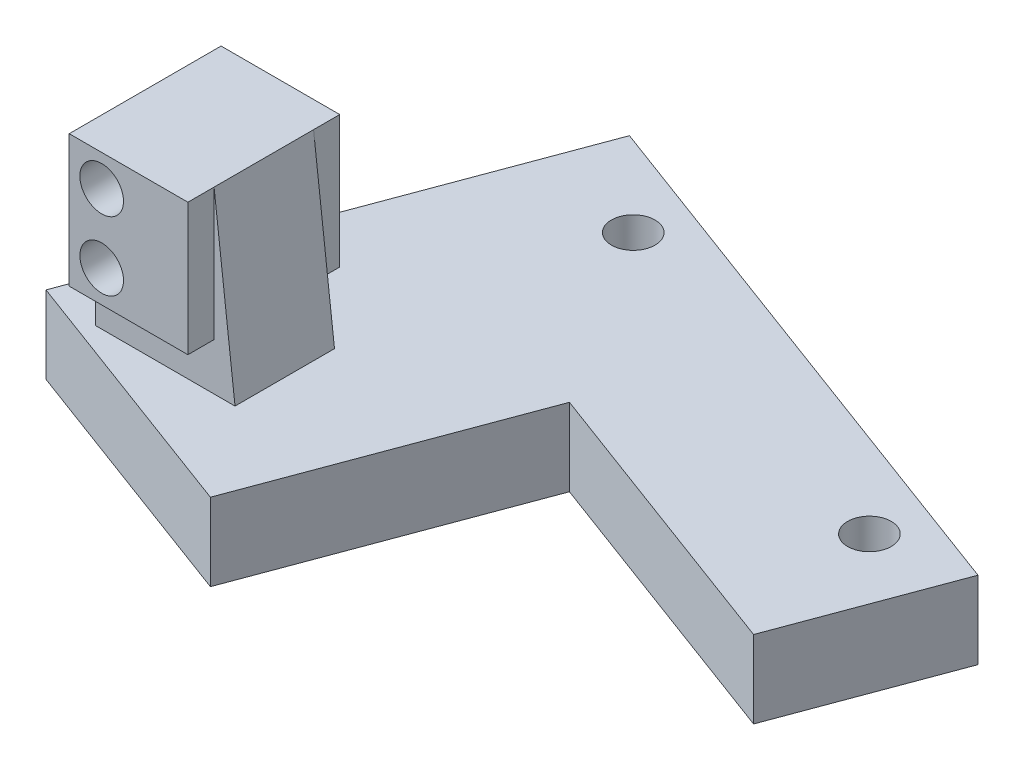
ISO-10303-21;
HEADER;
FILE_DESCRIPTION(('STEP AP214'),'2;1');
FILE_NAME('part.step','',(''),(''),'','','');
FILE_SCHEMA(('AUTOMOTIVE_DESIGN { 1 0 10303 214 1 1 1 1 }'));
ENDSEC;
DATA;
#1=APPLICATION_CONTEXT('core data for automotive mechanical design processes');
#2=APPLICATION_PROTOCOL_DEFINITION('international standard','automotive_design',2000,#1);
#3=PRODUCT_CONTEXT('',#1,'mechanical');
#4=PRODUCT('Part','Part','',(#3));
#5=PRODUCT_RELATED_PRODUCT_CATEGORY('part','',(#4));
#6=PRODUCT_DEFINITION_FORMATION('','',#4);
#7=PRODUCT_DEFINITION_CONTEXT('part definition',#1,'design');
#8=PRODUCT_DEFINITION('design','',#6,#7);
#9=PRODUCT_DEFINITION_SHAPE('','',#8);
#10=(LENGTH_UNIT() NAMED_UNIT(*) SI_UNIT(.MILLI.,.METRE.));
#11=(NAMED_UNIT(*) PLANE_ANGLE_UNIT() SI_UNIT($,.RADIAN.));
#12=(NAMED_UNIT(*) SI_UNIT($,.STERADIAN.) SOLID_ANGLE_UNIT());
#13=UNCERTAINTY_MEASURE_WITH_UNIT(LENGTH_MEASURE(1.E-05),#10,'distance_accuracy_value','');
#14=(GEOMETRIC_REPRESENTATION_CONTEXT(3) GLOBAL_UNCERTAINTY_ASSIGNED_CONTEXT((#13)) GLOBAL_UNIT_ASSIGNED_CONTEXT((#10,
#11,#12)) REPRESENTATION_CONTEXT('',''));
#15=CARTESIAN_POINT('',(0.,0.,0.));
#16=DIRECTION('',(0.,0.,1.));
#17=DIRECTION('',(1.,0.,0.));
#18=AXIS2_PLACEMENT_3D('',#15,#16,#17);
#19=CARTESIAN_POINT('',(-91.4998945327473,128.571708482202,-55.16093843316));
#20=DIRECTION('',(-1.,0.,0.));
#21=DIRECTION('',(0.,0.,-1.));
#22=AXIS2_PLACEMENT_3D('',#19,#20,#21);
#23=PLANE('',#22);
#24=DIRECTION('',(0.,-1.,0.));
#25=VECTOR('',#24,1.);
#26=CARTESIAN_POINT('',(-91.4998945327473,128.571708482202,-3.81));
#27=LINE('',#26,#25);
#28=CARTESIAN_POINT('',(-91.4998945327473,128.571708482202,-3.81));
#29=VERTEX_POINT('',#28);
#30=CARTESIAN_POINT('',(-91.4998945327473,109.348000374125,-3.81));
#31=VERTEX_POINT('',#30);
#32=EDGE_CURVE('E164',#29,#31,#27,.T.);
#33=ORIENTED_EDGE('',*,*,#32,.F.);
#34=DIRECTION('',(0.,0.,1.));
#35=VECTOR('',#34,1.);
#36=CARTESIAN_POINT('',(-91.4998945327473,128.571708482202,-55.16093843316));
#37=LINE('',#36,#35);
#38=CARTESIAN_POINT('',(-91.4998945327473,128.571708482202,0.));
#39=VERTEX_POINT('',#38);
#40=EDGE_CURVE('E260',#29,#39,#37,.T.);
#41=ORIENTED_EDGE('',*,*,#40,.T.);
#42=DIRECTION('',(0.,1.,0.));
#43=VECTOR('',#42,1.);
#44=CARTESIAN_POINT('',(-91.4998945327473,128.571708482202,0.));
#45=LINE('',#44,#43);
#46=CARTESIAN_POINT('',(-91.4998945327473,109.348000374125,0.));
#47=VERTEX_POINT('',#46);
#48=EDGE_CURVE('E249',#47,#39,#45,.T.);
#49=ORIENTED_EDGE('',*,*,#48,.F.);
#50=DIRECTION('',(0.,0.,-1.));
#51=VECTOR('',#50,1.);
#52=CARTESIAN_POINT('',(-91.4998945327473,109.348000374125,0.));
#53=LINE('',#52,#51);
#54=EDGE_CURVE('E175',#47,#31,#53,.T.);
#55=ORIENTED_EDGE('',*,*,#54,.T.);
#56=EDGE_LOOP('',(#33,#41,#49,#55));
#57=FACE_BOUND('',#56,.T.);
#58=ADVANCED_FACE('F41',(#57),#23,.F.);
#59=DIRECTION('',(0.,-1.,0.));
#60=VECTOR('',#59,1.);
#61=CARTESIAN_POINT('',(-91.4998945327473,128.571708482202,-18.288));
#62=LINE('',#61,#60);
#63=CARTESIAN_POINT('',(-91.4998945327473,128.571708482202,-18.288));
#64=VERTEX_POINT('',#63);
#65=CARTESIAN_POINT('',(-91.4998945327473,109.348000374125,-18.288));
#66=VERTEX_POINT('',#65);
#67=EDGE_CURVE('E151',#64,#66,#62,.T.);
#68=ORIENTED_EDGE('',*,*,#67,.T.);
#69=DIRECTION('',(0.,0.,-1.));
#70=VECTOR('',#69,1.);
#71=CARTESIAN_POINT('',(-91.4998945327473,109.348000374125,-22.0979999999999));
#72=LINE('',#71,#70);
#73=CARTESIAN_POINT('',(-91.4998945327473,109.348000374125,-22.0979999999999));
#74=VERTEX_POINT('',#73);
#75=EDGE_CURVE('E170',#66,#74,#72,.T.);
#76=ORIENTED_EDGE('',*,*,#75,.T.);
#77=DIRECTION('',(0.,-1.,0.));
#78=VECTOR('',#77,1.);
#79=CARTESIAN_POINT('',(-91.4998945327473,128.571708482202,-22.0979999999999));
#80=LINE('',#79,#78);
#81=CARTESIAN_POINT('',(-91.4998945327473,128.571708482202,-22.0979999999999));
#82=VERTEX_POINT('',#81);
#83=EDGE_CURVE('E252',#82,#74,#80,.T.);
#84=ORIENTED_EDGE('',*,*,#83,.F.);
#85=EDGE_CURVE('E248',#82,#64,#37,.T.);
#86=ORIENTED_EDGE('',*,*,#85,.T.);
#87=EDGE_LOOP('',(#68,#76,#84,#86));
#88=FACE_BOUND('',#87,.T.);
#89=ADVANCED_FACE('F293',(#88),#23,.F.);
#90=CARTESIAN_POINT('',(0.,102.490000374125,1.55740159258012E-13));
#91=DIRECTION('',(0.,1.,0.));
#92=DIRECTION('',(0.,0.,-1.));
#93=AXIS2_PLACEMENT_3D('',#90,#91,#92);
#94=PLANE('',#93);
#95=DIRECTION('',(-0.937285128834374,0.,-0.348563605767916));
#96=VECTOR('',#95,1.);
#97=CARTESIAN_POINT('',(-116.851792660847,102.490000374125,-4.69940885882034));
#98=LINE('',#97,#96);
#99=CARTESIAN_POINT('',(-78.7605250250181,102.490000374125,9.46621607958777));
#100=VERTEX_POINT('',#99);
#101=CARTESIAN_POINT('',(-116.851792660847,102.490000374125,-4.69940885882034));
#102=VERTEX_POINT('',#101);
#103=EDGE_CURVE('E188',#100,#102,#98,.T.);
#104=ORIENTED_EDGE('',*,*,#103,.F.);
#105=DIRECTION('',(-0.348563605767916,0.,0.937285128834374));
#106=VECTOR('',#105,1.);
#107=CARTESIAN_POINT('',(-78.7605250250181,102.490000374125,9.46621607958777));
#108=LINE('',#107,#106);
#109=CARTESIAN_POINT('',(-64.59490008661,102.490000374125,-28.6250515562412));
#110=VERTEX_POINT('',#109);
#111=EDGE_CURVE('E192',#110,#100,#108,.T.);
#112=ORIENTED_EDGE('',*,*,#111,.F.);
#113=DIRECTION('',(-0.937285128834374,0.,-0.348563605767916));
#114=VECTOR('',#113,1.);
#115=CARTESIAN_POINT('',(-64.59490008661,102.490000374125,-28.6250515562412));
#116=LINE('',#115,#114);
#117=CARTESIAN_POINT('',(-21.925888481416,102.490000374125,-12.7570258273408));
#118=VERTEX_POINT('',#117);
#119=EDGE_CURVE('E196',#118,#110,#116,.T.);
#120=ORIENTED_EDGE('',*,*,#119,.F.);
#121=DIRECTION('',(-0.348563605767916,0.,0.937285128834374));
#122=VECTOR('',#121,1.);
#123=CARTESIAN_POINT('',(-21.925888481416,102.490000374125,-12.7570258273408));
#124=LINE('',#123,#122);
#125=CARTESIAN_POINT('',(-13.072372894911,102.490000374125,-36.5640680997339));
#126=VERTEX_POINT('',#125);
#127=EDGE_CURVE('E199',#126,#118,#124,.T.);
#128=ORIENTED_EDGE('',*,*,#127,.F.);
#129=DIRECTION('',(0.937285128834374,0.,0.348563605767916));
#130=VECTOR('',#129,1.);
#131=CARTESIAN_POINT('',(-93.8326521359339,102.490000374125,-66.5977187670424));
#132=LINE('',#131,#130);
#133=CARTESIAN_POINT('',(-93.8326521359339,102.490000374125,-66.5977187670424));
#134=VERTEX_POINT('',#133);
#135=EDGE_CURVE('E202',#134,#126,#132,.T.);
#136=ORIENTED_EDGE('',*,*,#135,.F.);
#137=DIRECTION('',(0.348563605767916,0.,-0.937285128834374));
#138=VECTOR('',#137,1.);
#139=CARTESIAN_POINT('',(-116.851792660847,102.490000374125,-4.69940885882034));
#140=LINE('',#139,#138);
#141=EDGE_CURVE('E50',#102,#134,#140,.T.);
#142=ORIENTED_EDGE('',*,*,#141,.F.);
#143=EDGE_LOOP('',(#104,#112,#120,#128,#136,#142));
#144=FACE_BOUND('',#143,.T.);
#145=CARTESIAN_POINT('',(-26.1725046743068,102.490000374125,-33.8627353548147));
#146=DIRECTION('',(0.,-1.,0.));
#147=DIRECTION('',(0.,0.,-1.));
#148=AXIS2_PLACEMENT_3D('',#145,#146,#147);
#149=CIRCLE('',#148,3.175);
#150=CARTESIAN_POINT('',(-26.1725046743068,102.490000374125,-37.0377353548147));
#151=VERTEX_POINT('',#150);
#152=EDGE_CURVE('E205',#151,#151,#149,.T.);
#153=ORIENTED_EDGE('',*,*,#152,.T.);
#154=EDGE_LOOP('',(#153));
#155=FACE_BOUND('',#154,.T.);
#156=CARTESIAN_POINT('',(-81.3473263414442,102.490000374125,-54.659995842569));
#157=DIRECTION('',(0.,-1.,0.));
#158=DIRECTION('',(0.,0.,-1.));
#159=AXIS2_PLACEMENT_3D('',#156,#157,#158);
#160=CIRCLE('',#159,3.175);
#161=CARTESIAN_POINT('',(-81.3473263414442,102.490000374125,-57.834995842569));
#162=VERTEX_POINT('',#161);
#163=EDGE_CURVE('E208',#162,#162,#160,.T.);
#164=ORIENTED_EDGE('',*,*,#163,.T.);
#165=EDGE_LOOP('',(#164));
#166=FACE_BOUND('',#165,.T.);
#167=DIRECTION('',(1.,0.,0.));
#168=VECTOR('',#167,1.);
#169=CARTESIAN_POINT('',(-121.979894532747,102.490000374125,-3.81));
#170=LINE('',#169,#168);
#171=CARTESIAN_POINT('',(-108.771894532747,102.490000374125,-3.81));
#172=VERTEX_POINT('',#171);
#173=CARTESIAN_POINT('',(-88.4518945327473,102.490000374125,-3.81));
#174=VERTEX_POINT('',#173);
#175=EDGE_CURVE('E183',#172,#174,#170,.T.);
#176=ORIENTED_EDGE('',*,*,#175,.F.);
#177=DIRECTION('',(0.,0.,-1.));
#178=VECTOR('',#177,1.);
#179=CARTESIAN_POINT('',(-108.771894532747,102.490000374125,5.58800000000004));
#180=LINE('',#179,#178);
#181=CARTESIAN_POINT('',(-108.771894532747,102.490000374125,-18.288));
#182=VERTEX_POINT('',#181);
#183=EDGE_CURVE('E168',#172,#182,#180,.T.);
#184=ORIENTED_EDGE('',*,*,#183,.T.);
#185=DIRECTION('',(1.,0.,0.));
#186=VECTOR('',#185,1.);
#187=CARTESIAN_POINT('',(-121.979894532747,102.490000374125,-18.288));
#188=LINE('',#187,#186);
#189=CARTESIAN_POINT('',(-88.4518945327473,102.490000374125,-18.288));
#190=VERTEX_POINT('',#189);
#191=EDGE_CURVE('E148',#182,#190,#188,.T.);
#192=ORIENTED_EDGE('',*,*,#191,.T.);
#193=DIRECTION('',(0.,0.,-1.));
#194=VECTOR('',#193,1.);
#195=CARTESIAN_POINT('',(-88.4518945327473,102.490000374125,22.4492041355967));
#196=LINE('',#195,#194);
#197=EDGE_CURVE('E158',#174,#190,#196,.T.);
#198=ORIENTED_EDGE('',*,*,#197,.F.);
#199=EDGE_LOOP('',(#176,#184,#192,#198));
#200=FACE_BOUND('',#199,.T.);
#201=ADVANCED_FACE('F166',(#144,#155,#166,#200),#94,.T.);
#202=CARTESIAN_POINT('',(0.,0.,0.));
#203=DIRECTION('',(0.,0.,1.));
#204=DIRECTION('',(-1.,0.,0.));
#205=AXIS2_PLACEMENT_3D('',#202,#203,#204);
#206=PLANE('',#205);
#207=DIRECTION('',(0.,-1.,0.));
#208=VECTOR('',#207,1.);
#209=CARTESIAN_POINT('',(-108.771894532747,-1.15752639016153E-13,0.));
#210=LINE('',#209,#208);
#211=CARTESIAN_POINT('',(-108.771894532747,128.571708482202,0.));
#212=VERTEX_POINT('',#211);
#213=CARTESIAN_POINT('',(-108.771894532747,109.348000374125,0.));
#214=VERTEX_POINT('',#213);
#215=EDGE_CURVE('E185',#212,#214,#210,.T.);
#216=ORIENTED_EDGE('',*,*,#215,.T.);
#217=DIRECTION('',(1.,0.,0.));
#218=VECTOR('',#217,1.);
#219=CARTESIAN_POINT('',(-121.979894532747,109.348000374125,0.));
#220=LINE('',#219,#218);
#221=EDGE_CURVE('E179',#214,#47,#220,.T.);
#222=ORIENTED_EDGE('',*,*,#221,.T.);
#223=ORIENTED_EDGE('',*,*,#48,.T.);
#224=DIRECTION('',(-1.,0.,0.));
#225=VECTOR('',#224,1.);
#226=CARTESIAN_POINT('',(-111.819894532747,128.571708482202,0.));
#227=LINE('',#226,#225);
#228=EDGE_CURVE('E244',#39,#212,#227,.T.);
#229=ORIENTED_EDGE('',*,*,#228,.T.);
#230=EDGE_LOOP('',(#216,#222,#223,#229));
#231=FACE_BOUND('',#230,.T.);
#232=CARTESIAN_POINT('',(-104.050470740245,123.999999999999,0.));
#233=DIRECTION('',(0.,0.,1.));
#234=DIRECTION('',(1.,0.,0.));
#235=AXIS2_PLACEMENT_3D('',#232,#233,#234);
#236=CIRCLE('',#235,3.17499999999998);
#237=CARTESIAN_POINT('',(-100.875470740245,123.999999999999,0.));
#238=VERTEX_POINT('',#237);
#239=EDGE_CURVE('E217',#238,#238,#236,.T.);
#240=ORIENTED_EDGE('',*,*,#239,.F.);
#241=EDGE_LOOP('',(#240));
#242=FACE_BOUND('',#241,.T.);
#243=CARTESIAN_POINT('',(-104.045206420171,113.999999999999,0.));
#244=DIRECTION('',(0.,0.,1.));
#245=DIRECTION('',(1.,0.,0.));
#246=AXIS2_PLACEMENT_3D('',#243,#244,#245);
#247=CIRCLE('',#246,3.17499999999995);
#248=CARTESIAN_POINT('',(-100.870206420171,113.999999999999,0.));
#249=VERTEX_POINT('',#248);
#250=EDGE_CURVE('E255',#249,#249,#247,.T.);
#251=ORIENTED_EDGE('',*,*,#250,.F.);
#252=EDGE_LOOP('',(#251));
#253=FACE_BOUND('',#252,.T.);
#254=ADVANCED_FACE('F282',(#231,#242,#253),#206,.T.);
#255=CARTESIAN_POINT('',(-111.819894532747,128.571708482202,-55.16093843316));
#256=DIRECTION('',(0.,-1.,0.));
#257=DIRECTION('',(0.,0.,1.));
#258=AXIS2_PLACEMENT_3D('',#255,#256,#257);
#259=PLANE('',#258);
#260=ORIENTED_EDGE('',*,*,#228,.F.);
#261=ORIENTED_EDGE('',*,*,#40,.F.);
#262=DIRECTION('',(0.,0.,-1.));
#263=VECTOR('',#262,1.);
#264=CARTESIAN_POINT('',(-91.4998945327473,128.571708482202,22.4492041355967));
#265=LINE('',#264,#263);
#266=EDGE_CURVE('E155',#29,#64,#265,.T.);
#267=ORIENTED_EDGE('',*,*,#266,.T.);
#268=ORIENTED_EDGE('',*,*,#85,.F.);
#269=DIRECTION('',(1.,0.,0.));
#270=VECTOR('',#269,1.);
#271=CARTESIAN_POINT('',(-111.819894532747,128.571708482202,-22.0979999999999));
#272=LINE('',#271,#270);
#273=CARTESIAN_POINT('',(-108.771894532747,128.571708482202,-22.098));
#274=VERTEX_POINT('',#273);
#275=EDGE_CURVE('E56',#274,#82,#272,.T.);
#276=ORIENTED_EDGE('',*,*,#275,.F.);
#277=DIRECTION('',(0.,0.,-1.));
#278=VECTOR('',#277,1.);
#279=CARTESIAN_POINT('',(-108.771894532747,128.571708482202,5.58800000000004));
#280=LINE('',#279,#278);
#281=EDGE_CURVE('E514',#212,#274,#280,.T.);
#282=ORIENTED_EDGE('',*,*,#281,.F.);
#283=EDGE_LOOP('',(#260,#261,#267,#268,#276,#282));
#284=FACE_BOUND('',#283,.T.);
#285=ADVANCED_FACE('F278',(#284),#259,.F.);
#286=CARTESIAN_POINT('',(-104.050470740245,123.999999999999,-55.16093843316));
#287=DIRECTION('',(0.,0.,1.));
#288=DIRECTION('',(-1.,0.,0.));
#289=AXIS2_PLACEMENT_3D('',#286,#287,#288);
#290=CYLINDRICAL_SURFACE('',#289,3.17499999999998);
#291=CARTESIAN_POINT('',(-104.050470740245,123.999999999999,-22.0979999999999));
#292=DIRECTION('',(0.,0.,-1.));
#293=DIRECTION('',(0.,1.,0.));
#294=AXIS2_PLACEMENT_3D('',#291,#292,#293);
#295=CIRCLE('',#294,3.17499999999998);
#296=CARTESIAN_POINT('',(-104.050470740245,127.174999999999,-22.0979999999999));
#297=VERTEX_POINT('',#296);
#298=EDGE_CURVE('E191',#297,#297,#295,.T.);
#299=ORIENTED_EDGE('',*,*,#298,.T.);
#300=EDGE_LOOP('',(#299));
#301=FACE_BOUND('',#300,.T.);
#302=ORIENTED_EDGE('',*,*,#239,.T.);
#303=EDGE_LOOP('',(#302));
#304=FACE_BOUND('',#303,.T.);
#305=ADVANCED_FACE('F275',(#301,#304),#290,.F.);
#306=CARTESIAN_POINT('',(-104.045206420171,113.999999999999,-55.16093843316));
#307=DIRECTION('',(0.,0.,1.));
#308=DIRECTION('',(-1.,0.,0.));
#309=AXIS2_PLACEMENT_3D('',#306,#307,#308);
#310=CYLINDRICAL_SURFACE('',#309,3.17499999999995);
#311=CARTESIAN_POINT('',(-104.045206420171,113.999999999999,-22.0979999999999));
#312=DIRECTION('',(0.,0.,-1.));
#313=DIRECTION('',(0.,1.,0.));
#314=AXIS2_PLACEMENT_3D('',#311,#312,#313);
#315=CIRCLE('',#314,3.17499999999995);
#316=CARTESIAN_POINT('',(-104.045206420171,117.174999999998,-22.0979999999999));
#317=VERTEX_POINT('',#316);
#318=EDGE_CURVE('E247',#317,#317,#315,.T.);
#319=ORIENTED_EDGE('',*,*,#318,.T.);
#320=EDGE_LOOP('',(#319));
#321=FACE_BOUND('',#320,.T.);
#322=ORIENTED_EDGE('',*,*,#250,.T.);
#323=EDGE_LOOP('',(#322));
#324=FACE_BOUND('',#323,.T.);
#325=ADVANCED_FACE('F267',(#321,#324),#310,.F.);
#326=CARTESIAN_POINT('',(-135.790161013805,109.407487112952,-22.0979999999999));
#327=DIRECTION('',(0.,0.,1.));
#328=DIRECTION('',(-1.,0.,0.));
#329=AXIS2_PLACEMENT_3D('',#326,#327,#328);
#330=PLANE('',#329);
#331=ORIENTED_EDGE('',*,*,#318,.F.);
#332=EDGE_LOOP('',(#331));
#333=FACE_BOUND('',#332,.T.);
#334=ORIENTED_EDGE('',*,*,#298,.F.);
#335=EDGE_LOOP('',(#334));
#336=FACE_BOUND('',#335,.T.);
#337=ORIENTED_EDGE('',*,*,#275,.T.);
#338=ORIENTED_EDGE('',*,*,#83,.T.);
#339=DIRECTION('',(1.,0.,0.));
#340=VECTOR('',#339,1.);
#341=CARTESIAN_POINT('',(-121.979894532747,109.348000374125,-22.0979999999999));
#342=LINE('',#341,#340);
#343=CARTESIAN_POINT('',(-108.771894532747,109.348000374125,-22.098));
#344=VERTEX_POINT('',#343);
#345=EDGE_CURVE('E172',#344,#74,#342,.T.);
#346=ORIENTED_EDGE('',*,*,#345,.F.);
#347=DIRECTION('',(0.,1.,0.));
#348=VECTOR('',#347,1.);
#349=CARTESIAN_POINT('',(-108.771894532747,128.571708482202,-22.098));
#350=LINE('',#349,#348);
#351=EDGE_CURVE('E531',#344,#274,#350,.T.);
#352=ORIENTED_EDGE('',*,*,#351,.T.);
#353=EDGE_LOOP('',(#337,#338,#346,#352));
#354=FACE_BOUND('',#353,.T.);
#355=ADVANCED_FACE('F43',(#333,#336,#354),#330,.F.);
#356=CARTESIAN_POINT('',(-116.851792660847,-37.4582939893272,-4.69940885882056));
#357=DIRECTION('',(-0.937285128834374,0.,-0.348563605767916));
#358=DIRECTION('',(0.348563605767916,0.,-0.937285128834374));
#359=AXIS2_PLACEMENT_3D('',#356,#357,#358);
#360=PLANE('',#359);
#361=DIRECTION('',(0.,1.,0.));
#362=VECTOR('',#361,1.);
#363=CARTESIAN_POINT('',(-116.851792660847,-37.4582939893272,-4.69940885882056));
#364=LINE('',#363,#362);
#365=CARTESIAN_POINT('',(-116.851792660847,91.2113999999987,-4.69940885882036));
#366=VERTEX_POINT('',#365);
#367=EDGE_CURVE('E229',#366,#102,#364,.T.);
#368=ORIENTED_EDGE('',*,*,#367,.T.);
#369=ORIENTED_EDGE('',*,*,#141,.T.);
#370=DIRECTION('',(0.,1.,0.));
#371=VECTOR('',#370,1.);
#372=CARTESIAN_POINT('',(-93.8326521359338,-37.4582939893271,-66.5977187670426));
#373=LINE('',#372,#371);
#374=CARTESIAN_POINT('',(-93.8326521359339,91.2113999999988,-66.5977187670424));
#375=VERTEX_POINT('',#374);
#376=EDGE_CURVE('E226',#375,#134,#373,.T.);
#377=ORIENTED_EDGE('',*,*,#376,.F.);
#378=DIRECTION('',(0.348563605767916,0.,-0.937285128834374));
#379=VECTOR('',#378,1.);
#380=CARTESIAN_POINT('',(-116.851792660847,91.2113999999987,-4.69940885882037));
#381=LINE('',#380,#379);
#382=EDGE_CURVE('E223',#366,#375,#381,.T.);
#383=ORIENTED_EDGE('',*,*,#382,.F.);
#384=EDGE_LOOP('',(#368,#369,#377,#383));
#385=FACE_BOUND('',#384,.T.);
#386=ADVANCED_FACE('F272',(#385),#360,.T.);
#387=CARTESIAN_POINT('',(-116.851792660847,-37.4582939893272,-4.69940885882056));
#388=DIRECTION('',(-0.348563605767916,0.,0.937285128834374));
#389=DIRECTION('',(-0.937285128834374,0.,-0.348563605767916));
#390=AXIS2_PLACEMENT_3D('',#387,#388,#389);
#391=PLANE('',#390);
#392=DIRECTION('',(0.,1.,0.));
#393=VECTOR('',#392,1.);
#394=CARTESIAN_POINT('',(-78.760525025018,-37.4582939893272,9.46621607958755));
#395=LINE('',#394,#393);
#396=CARTESIAN_POINT('',(-78.7605250250181,91.2113999999987,9.46621607958777));
#397=VERTEX_POINT('',#396);
#398=EDGE_CURVE('E232',#397,#100,#395,.T.);
#399=ORIENTED_EDGE('',*,*,#398,.T.);
#400=ORIENTED_EDGE('',*,*,#103,.T.);
#401=ORIENTED_EDGE('',*,*,#367,.F.);
#402=DIRECTION('',(-0.937285128834374,0.,-0.348563605767916));
#403=VECTOR('',#402,1.);
#404=CARTESIAN_POINT('',(-116.851792660847,91.2113999999987,-4.69940885882035));
#405=LINE('',#404,#403);
#406=EDGE_CURVE('E227',#397,#366,#405,.T.);
#407=ORIENTED_EDGE('',*,*,#406,.F.);
#408=EDGE_LOOP('',(#399,#400,#401,#407));
#409=FACE_BOUND('',#408,.T.);
#410=ADVANCED_FACE('F320',(#409),#391,.T.);
#411=CARTESIAN_POINT('',(-78.760525025018,-37.4582939893272,9.46621607958755));
#412=DIRECTION('',(0.937285128834374,0.,0.348563605767916));
#413=DIRECTION('',(-0.348563605767916,0.,0.937285128834374));
#414=AXIS2_PLACEMENT_3D('',#411,#412,#413);
#415=PLANE('',#414);
#416=DIRECTION('',(0.,1.,0.));
#417=VECTOR('',#416,1.);
#418=CARTESIAN_POINT('',(-64.5949000866099,-37.4582939893272,-28.6250515562414));
#419=LINE('',#418,#417);
#420=CARTESIAN_POINT('',(-64.59490008661,91.2113999999987,-28.6250515562412));
#421=VERTEX_POINT('',#420);
#422=EDGE_CURVE('E235',#421,#110,#419,.T.);
#423=ORIENTED_EDGE('',*,*,#422,.T.);
#424=ORIENTED_EDGE('',*,*,#111,.T.);
#425=ORIENTED_EDGE('',*,*,#398,.F.);
#426=DIRECTION('',(-0.348563605767916,0.,0.937285128834374));
#427=VECTOR('',#426,1.);
#428=CARTESIAN_POINT('',(-78.7605250250181,91.2113999999987,9.46621607958774));
#429=LINE('',#428,#427);
#430=EDGE_CURVE('E230',#421,#397,#429,.T.);
#431=ORIENTED_EDGE('',*,*,#430,.F.);
#432=EDGE_LOOP('',(#423,#424,#425,#431));
#433=FACE_BOUND('',#432,.T.);
#434=ADVANCED_FACE('F324',(#433),#415,.T.);
#435=CARTESIAN_POINT('',(-64.5949000866099,-37.4582939893272,-28.6250515562414));
#436=DIRECTION('',(-0.348563605767916,0.,0.937285128834374));
#437=DIRECTION('',(-0.937285128834374,0.,-0.348563605767916));
#438=AXIS2_PLACEMENT_3D('',#435,#436,#437);
#439=PLANE('',#438);
#440=DIRECTION('',(0.,1.,0.));
#441=VECTOR('',#440,1.);
#442=CARTESIAN_POINT('',(-21.9258884814159,-37.4582939893272,-12.7570258273411));
#443=LINE('',#442,#441);
#444=CARTESIAN_POINT('',(-21.925888481416,91.2113999999987,-12.7570258273408));
#445=VERTEX_POINT('',#444);
#446=EDGE_CURVE('E222',#445,#118,#443,.T.);
#447=ORIENTED_EDGE('',*,*,#446,.T.);
#448=ORIENTED_EDGE('',*,*,#119,.T.);
#449=ORIENTED_EDGE('',*,*,#422,.F.);
#450=DIRECTION('',(-0.937285128834374,0.,-0.348563605767916));
#451=VECTOR('',#450,1.);
#452=CARTESIAN_POINT('',(-64.59490008661,91.2113999999987,-28.6250515562412));
#453=LINE('',#452,#451);
#454=EDGE_CURVE('E233',#445,#421,#453,.T.);
#455=ORIENTED_EDGE('',*,*,#454,.F.);
#456=EDGE_LOOP('',(#447,#448,#449,#455));
#457=FACE_BOUND('',#456,.T.);
#458=ADVANCED_FACE('F328',(#457),#439,.T.);
#459=CARTESIAN_POINT('',(-21.9258884814159,-37.4582939893272,-12.7570258273411));
#460=DIRECTION('',(0.937285128834374,0.,0.348563605767916));
#461=DIRECTION('',(-0.348563605767916,0.,0.937285128834374));
#462=AXIS2_PLACEMENT_3D('',#459,#460,#461);
#463=PLANE('',#462);
#464=DIRECTION('',(0.,1.,0.));
#465=VECTOR('',#464,1.);
#466=CARTESIAN_POINT('',(-13.0723728949109,-37.4582939893271,-36.5640680997342));
#467=LINE('',#466,#465);
#468=CARTESIAN_POINT('',(-13.0723728949109,91.2113999999988,-36.564068099734));
#469=VERTEX_POINT('',#468);
#470=EDGE_CURVE('E211',#469,#126,#467,.T.);
#471=ORIENTED_EDGE('',*,*,#470,.T.);
#472=ORIENTED_EDGE('',*,*,#127,.T.);
#473=ORIENTED_EDGE('',*,*,#446,.F.);
#474=DIRECTION('',(-0.348563605767916,0.,0.937285128834374));
#475=VECTOR('',#474,1.);
#476=CARTESIAN_POINT('',(-21.925888481416,91.2113999999987,-12.7570258273409));
#477=LINE('',#476,#475);
#478=EDGE_CURVE('E236',#469,#445,#477,.T.);
#479=ORIENTED_EDGE('',*,*,#478,.F.);
#480=EDGE_LOOP('',(#471,#472,#473,#479));
#481=FACE_BOUND('',#480,.T.);
#482=ADVANCED_FACE('F332',(#481),#463,.T.);
#483=CARTESIAN_POINT('',(-93.8326521359338,-37.4582939893271,-66.5977187670426));
#484=DIRECTION('',(0.348563605767916,0.,-0.937285128834374));
#485=DIRECTION('',(0.937285128834374,0.,0.348563605767916));
#486=AXIS2_PLACEMENT_3D('',#483,#484,#485);
#487=PLANE('',#486);
#488=ORIENTED_EDGE('',*,*,#376,.T.);
#489=ORIENTED_EDGE('',*,*,#135,.T.);
#490=ORIENTED_EDGE('',*,*,#470,.F.);
#491=DIRECTION('',(0.937285128834374,0.,0.348563605767916));
#492=VECTOR('',#491,1.);
#493=CARTESIAN_POINT('',(-93.8326521359339,91.2113999999988,-66.5977187670424));
#494=LINE('',#493,#492);
#495=EDGE_CURVE('E220',#375,#469,#494,.T.);
#496=ORIENTED_EDGE('',*,*,#495,.F.);
#497=EDGE_LOOP('',(#488,#489,#490,#496));
#498=FACE_BOUND('',#497,.T.);
#499=ADVANCED_FACE('F316',(#498),#487,.T.);
#500=CARTESIAN_POINT('',(-81.3473263414441,-37.4582939893272,-54.6599958425692));
#501=DIRECTION('',(0.,1.,0.));
#502=DIRECTION('',(0.,0.,-1.));
#503=AXIS2_PLACEMENT_3D('',#500,#501,#502);
#504=CYLINDRICAL_SURFACE('',#503,3.175);
#505=ORIENTED_EDGE('',*,*,#163,.F.);
#506=EDGE_LOOP('',(#505));
#507=FACE_BOUND('',#506,.T.);
#508=CARTESIAN_POINT('',(-81.3473263414442,91.2113999999988,-54.659995842569));
#509=DIRECTION('',(0.,1.,0.));
#510=DIRECTION('',(0.,0.,1.));
#511=AXIS2_PLACEMENT_3D('',#508,#509,#510);
#512=CIRCLE('',#511,3.175);
#513=CARTESIAN_POINT('',(-81.3473263414442,91.2113999999988,-51.484995842569));
#514=VERTEX_POINT('',#513);
#515=EDGE_CURVE('E214',#514,#514,#512,.F.);
#516=ORIENTED_EDGE('',*,*,#515,.T.);
#517=EDGE_LOOP('',(#516));
#518=FACE_BOUND('',#517,.T.);
#519=ADVANCED_FACE('F312',(#507,#518),#504,.F.);
#520=CARTESIAN_POINT('',(-26.1725046743067,-37.4582939893271,-33.8627353548149));
#521=DIRECTION('',(0.,1.,0.));
#522=DIRECTION('',(0.,0.,-1.));
#523=AXIS2_PLACEMENT_3D('',#520,#521,#522);
#524=CYLINDRICAL_SURFACE('',#523,3.175);
#525=ORIENTED_EDGE('',*,*,#152,.F.);
#526=EDGE_LOOP('',(#525));
#527=FACE_BOUND('',#526,.T.);
#528=CARTESIAN_POINT('',(-26.1725046743068,91.2113999999988,-33.8627353548147));
#529=DIRECTION('',(0.,1.,0.));
#530=DIRECTION('',(0.,0.,1.));
#531=AXIS2_PLACEMENT_3D('',#528,#529,#530);
#532=CIRCLE('',#531,3.175);
#533=CARTESIAN_POINT('',(-26.1725046743068,91.2113999999988,-30.6877353548147));
#534=VERTEX_POINT('',#533);
#535=EDGE_CURVE('E195',#534,#534,#532,.F.);
#536=ORIENTED_EDGE('',*,*,#535,.T.);
#537=EDGE_LOOP('',(#536));
#538=FACE_BOUND('',#537,.T.);
#539=ADVANCED_FACE('F308',(#527,#538),#524,.F.);
#540=CARTESIAN_POINT('',(-81.3473263414442,91.2113999999988,-54.6599958425688));
#541=DIRECTION('',(0.,-1.,0.));
#542=DIRECTION('',(0.216516171096293,0.,0.976279031657344));
#543=AXIS2_PLACEMENT_3D('',#540,#541,#542);
#544=PLANE('',#543);
#545=ORIENTED_EDGE('',*,*,#382,.T.);
#546=ORIENTED_EDGE('',*,*,#495,.T.);
#547=ORIENTED_EDGE('',*,*,#478,.T.);
#548=ORIENTED_EDGE('',*,*,#454,.T.);
#549=ORIENTED_EDGE('',*,*,#430,.T.);
#550=ORIENTED_EDGE('',*,*,#406,.T.);
#551=EDGE_LOOP('',(#545,#546,#547,#548,#549,#550));
#552=FACE_BOUND('',#551,.T.);
#553=ORIENTED_EDGE('',*,*,#535,.F.);
#554=EDGE_LOOP('',(#553));
#555=FACE_BOUND('',#554,.T.);
#556=ORIENTED_EDGE('',*,*,#515,.F.);
#557=EDGE_LOOP('',(#556));
#558=FACE_BOUND('',#557,.T.);
#559=ADVANCED_FACE('F304',(#552,#555,#558),#544,.T.);
#560=CARTESIAN_POINT('',(-121.979894532747,109.348000374125,0.));
#561=DIRECTION('',(0.,1.,0.));
#562=DIRECTION('',(0.,0.,-1.));
#563=AXIS2_PLACEMENT_3D('',#560,#561,#562);
#564=PLANE('',#563);
#565=DIRECTION('',(1.,0.,0.));
#566=VECTOR('',#565,1.);
#567=CARTESIAN_POINT('',(-121.979894532747,109.348000374125,-3.81));
#568=LINE('',#567,#566);
#569=CARTESIAN_POINT('',(-108.771894532747,109.348000374125,-3.81));
#570=VERTEX_POINT('',#569);
#571=EDGE_CURVE('E181',#570,#31,#568,.T.);
#572=ORIENTED_EDGE('',*,*,#571,.T.);
#573=ORIENTED_EDGE('',*,*,#54,.F.);
#574=ORIENTED_EDGE('',*,*,#221,.F.);
#575=DIRECTION('',(0.,0.,1.));
#576=VECTOR('',#575,1.);
#577=CARTESIAN_POINT('',(-108.771894532747,109.348000374125,0.));
#578=LINE('',#577,#576);
#579=EDGE_CURVE('E516',#570,#214,#578,.T.);
#580=ORIENTED_EDGE('',*,*,#579,.F.);
#581=EDGE_LOOP('',(#572,#573,#574,#580));
#582=FACE_BOUND('',#581,.T.);
#583=ADVANCED_FACE('F307',(#582),#564,.F.);
#584=CARTESIAN_POINT('',(-121.979894532747,102.490000374125,-3.81));
#585=DIRECTION('',(0.,0.,-1.));
#586=DIRECTION('',(1.,0.,0.));
#587=AXIS2_PLACEMENT_3D('',#584,#585,#586);
#588=PLANE('',#587);
#589=ORIENTED_EDGE('',*,*,#175,.T.);
#590=DIRECTION('',(-0.116073586398918,0.993240616638533,0.));
#591=VECTOR('',#590,1.);
#592=CARTESIAN_POINT('',(-88.4518945327473,102.490000374125,-3.81));
#593=LINE('',#592,#591);
#594=EDGE_CURVE('E160',#174,#29,#593,.T.);
#595=ORIENTED_EDGE('',*,*,#594,.T.);
#596=ORIENTED_EDGE('',*,*,#32,.T.);
#597=ORIENTED_EDGE('',*,*,#571,.F.);
#598=DIRECTION('',(0.,1.,0.));
#599=VECTOR('',#598,1.);
#600=CARTESIAN_POINT('',(-108.771894532747,102.490000374125,-3.81));
#601=LINE('',#600,#599);
#602=EDGE_CURVE('E519',#172,#570,#601,.T.);
#603=ORIENTED_EDGE('',*,*,#602,.F.);
#604=EDGE_LOOP('',(#589,#595,#596,#597,#603));
#605=FACE_BOUND('',#604,.T.);
#606=ADVANCED_FACE('F343',(#605),#588,.F.);
#607=CARTESIAN_POINT('',(-121.979894532747,109.348000374125,-22.0979999999999));
#608=DIRECTION('',(0.,1.,0.));
#609=DIRECTION('',(0.,0.,-1.));
#610=AXIS2_PLACEMENT_3D('',#607,#608,#609);
#611=PLANE('',#610);
#612=ORIENTED_EDGE('',*,*,#345,.T.);
#613=ORIENTED_EDGE('',*,*,#75,.F.);
#614=DIRECTION('',(1.,0.,0.));
#615=VECTOR('',#614,1.);
#616=CARTESIAN_POINT('',(-121.979894532747,109.348000374125,-18.288));
#617=LINE('',#616,#615);
#618=CARTESIAN_POINT('',(-108.771894532747,109.348000374125,-18.288));
#619=VERTEX_POINT('',#618);
#620=EDGE_CURVE('E169',#619,#66,#617,.T.);
#621=ORIENTED_EDGE('',*,*,#620,.F.);
#622=DIRECTION('',(0.,0.,1.));
#623=VECTOR('',#622,1.);
#624=CARTESIAN_POINT('',(-108.771894532747,109.348000374125,-22.0979999999999));
#625=LINE('',#624,#623);
#626=EDGE_CURVE('E526',#344,#619,#625,.T.);
#627=ORIENTED_EDGE('',*,*,#626,.F.);
#628=EDGE_LOOP('',(#612,#613,#621,#627));
#629=FACE_BOUND('',#628,.T.);
#630=ADVANCED_FACE('F346',(#629),#611,.F.);
#631=CARTESIAN_POINT('',(-121.979894532747,102.490000374125,-18.288));
#632=DIRECTION('',(0.,0.,1.));
#633=DIRECTION('',(-1.,0.,0.));
#634=AXIS2_PLACEMENT_3D('',#631,#632,#633);
#635=PLANE('',#634);
#636=ORIENTED_EDGE('',*,*,#620,.T.);
#637=ORIENTED_EDGE('',*,*,#67,.F.);
#638=DIRECTION('',(-0.116073586398918,0.993240616638533,0.));
#639=VECTOR('',#638,1.);
#640=CARTESIAN_POINT('',(-88.4518945327473,102.490000374125,-18.2879999999999));
#641=LINE('',#640,#639);
#642=EDGE_CURVE('E144',#190,#64,#641,.T.);
#643=ORIENTED_EDGE('',*,*,#642,.F.);
#644=ORIENTED_EDGE('',*,*,#191,.F.);
#645=DIRECTION('',(0.,-1.,0.));
#646=VECTOR('',#645,1.);
#647=CARTESIAN_POINT('',(-108.771894532747,102.490000374125,-18.288));
#648=LINE('',#647,#646);
#649=EDGE_CURVE('E11',#619,#182,#648,.T.);
#650=ORIENTED_EDGE('',*,*,#649,.F.);
#651=EDGE_LOOP('',(#636,#637,#643,#644,#650));
#652=FACE_BOUND('',#651,.T.);
#653=ADVANCED_FACE('F146',(#652),#635,.F.);
#654=CARTESIAN_POINT('',(-108.771894532747,128.571708482202,5.58800000000004));
#655=DIRECTION('',(1.,0.,0.));
#656=DIRECTION('',(0.,1.,0.));
#657=AXIS2_PLACEMENT_3D('',#654,#655,#656);
#658=PLANE('',#657);
#659=ORIENTED_EDGE('',*,*,#215,.F.);
#660=ORIENTED_EDGE('',*,*,#281,.T.);
#661=ORIENTED_EDGE('',*,*,#351,.F.);
#662=ORIENTED_EDGE('',*,*,#626,.T.);
#663=ORIENTED_EDGE('',*,*,#649,.T.);
#664=ORIENTED_EDGE('',*,*,#183,.F.);
#665=ORIENTED_EDGE('',*,*,#602,.T.);
#666=ORIENTED_EDGE('',*,*,#579,.T.);
#667=EDGE_LOOP('',(#659,#660,#661,#662,#663,#664,#665,#666));
#668=FACE_BOUND('',#667,.T.);
#669=ADVANCED_FACE('F353',(#668),#658,.F.);
#670=CARTESIAN_POINT('',(-88.4518945327473,102.490000374125,22.4492041355967));
#671=DIRECTION('',(-0.993240616638533,-0.116073586398918,0.));
#672=DIRECTION('',(0.116073586398918,-0.993240616638533,0.));
#673=AXIS2_PLACEMENT_3D('',#670,#671,#672);
#674=PLANE('',#673);
#675=ORIENTED_EDGE('',*,*,#197,.T.);
#676=ORIENTED_EDGE('',*,*,#642,.T.);
#677=ORIENTED_EDGE('',*,*,#266,.F.);
#678=ORIENTED_EDGE('',*,*,#594,.F.);
#679=EDGE_LOOP('',(#675,#676,#677,#678));
#680=FACE_BOUND('',#679,.T.);
#681=ADVANCED_FACE('F159',(#680),#674,.F.);
#682=CLOSED_SHELL('',(#58,#89,#201,#254,#285,#305,#325,#355,#386,#410,#434,#458,#482,#499,#519,
#539,#559,#583,#606,#630,#653,#669,#681));
#683=MANIFOLD_SOLID_BREP('B2',#682);
#684=ADVANCED_BREP_SHAPE_REPRESENTATION('',(#18,#683),#14);
#685=SHAPE_DEFINITION_REPRESENTATION(#9,#684);
ENDSEC;
END-ISO-10303-21;
